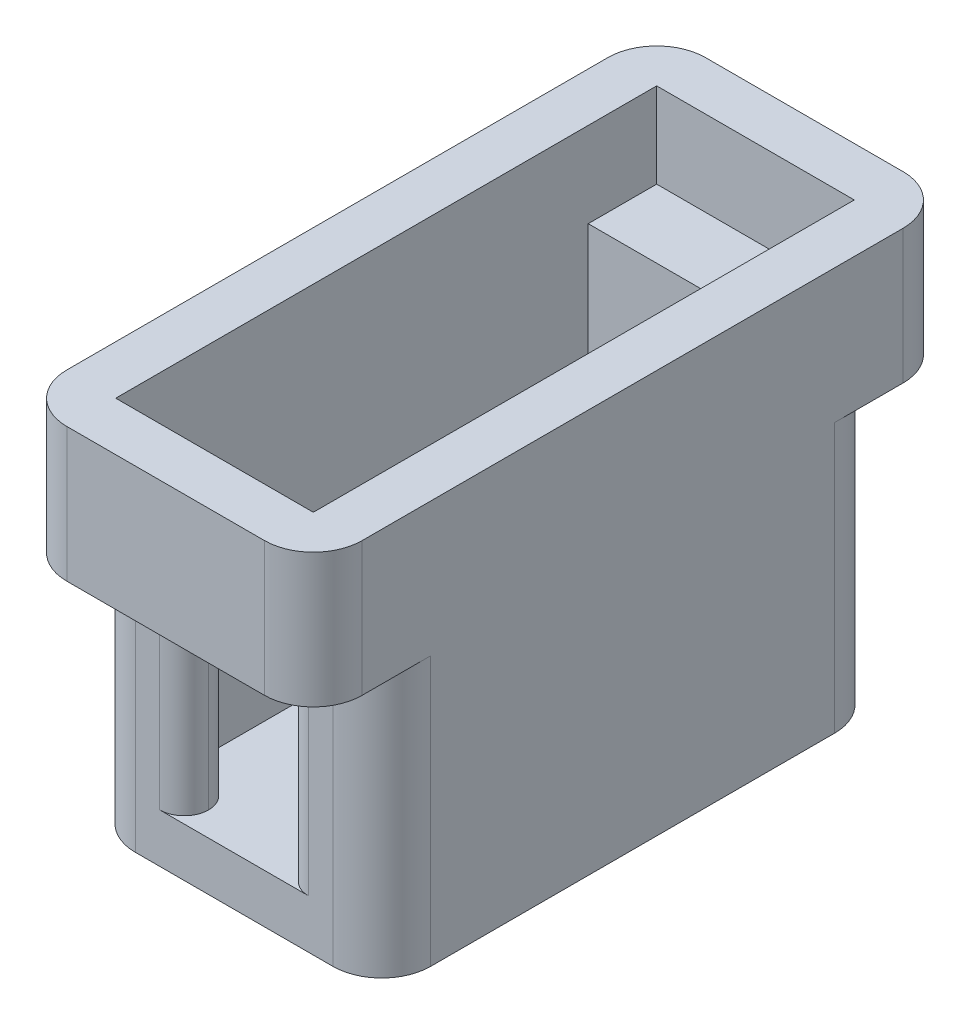
ISO-10303-21;
HEADER;
FILE_DESCRIPTION(('STEP AP214'),'2;1');
FILE_NAME('part.step','',(''),(''),'','','');
FILE_SCHEMA(('AUTOMOTIVE_DESIGN { 1 0 10303 214 1 1 1 1 }'));
ENDSEC;
DATA;
#1=APPLICATION_CONTEXT('core data for automotive mechanical design processes');
#2=APPLICATION_PROTOCOL_DEFINITION('international standard','automotive_design',2000,#1);
#3=PRODUCT_CONTEXT('',#1,'mechanical');
#4=PRODUCT('Part','Part','',(#3));
#5=PRODUCT_RELATED_PRODUCT_CATEGORY('part','',(#4));
#6=PRODUCT_DEFINITION_FORMATION('','',#4);
#7=PRODUCT_DEFINITION_CONTEXT('part definition',#1,'design');
#8=PRODUCT_DEFINITION('design','',#6,#7);
#9=PRODUCT_DEFINITION_SHAPE('','',#8);
#10=(LENGTH_UNIT() NAMED_UNIT(*) SI_UNIT(.MILLI.,.METRE.));
#11=(NAMED_UNIT(*) PLANE_ANGLE_UNIT() SI_UNIT($,.RADIAN.));
#12=(NAMED_UNIT(*) SI_UNIT($,.STERADIAN.) SOLID_ANGLE_UNIT());
#13=UNCERTAINTY_MEASURE_WITH_UNIT(LENGTH_MEASURE(1.E-05),#10,'distance_accuracy_value','');
#14=(GEOMETRIC_REPRESENTATION_CONTEXT(3) GLOBAL_UNCERTAINTY_ASSIGNED_CONTEXT((#13)) GLOBAL_UNIT_ASSIGNED_CONTEXT((#10,
#11,#12)) REPRESENTATION_CONTEXT('',''));
#15=CARTESIAN_POINT('',(0.,0.,0.));
#16=DIRECTION('',(0.,0.,1.));
#17=DIRECTION('',(1.,0.,0.));
#18=AXIS2_PLACEMENT_3D('',#15,#16,#17);
#19=CARTESIAN_POINT('',(0.,32.5,0.));
#20=DIRECTION('',(0.,1.,0.));
#21=DIRECTION('',(0.,0.,1.));
#22=AXIS2_PLACEMENT_3D('',#19,#20,#21);
#23=PLANE('',#22);
#24=DIRECTION('',(-1.,0.,0.));
#25=VECTOR('',#24,1.);
#26=CARTESIAN_POINT('',(-15.1,32.5,25.65));
#27=LINE('',#26,#25);
#28=CARTESIAN_POINT('',(2.59999999999999,32.5,25.65));
#29=VERTEX_POINT('',#28);
#30=CARTESIAN_POINT('',(-2.6,32.5,25.65));
#31=VERTEX_POINT('',#30);
#32=EDGE_CURVE('E351',#29,#31,#27,.T.);
#33=ORIENTED_EDGE('',*,*,#32,.T.);
#34=CARTESIAN_POINT('',(-2.6,32.5,23.15));
#35=DIRECTION('',(0.,1.,0.));
#36=DIRECTION('',(0.,0.,1.));
#37=AXIS2_PLACEMENT_3D('',#34,#35,#36);
#38=CIRCLE('',#37,2.5);
#39=CARTESIAN_POINT('',(-5.1,32.5,23.15));
#40=VERTEX_POINT('',#39);
#41=EDGE_CURVE('E591',#31,#40,#38,.F.);
#42=ORIENTED_EDGE('',*,*,#41,.T.);
#43=CARTESIAN_POINT('',(-7.6,32.5,23.15));
#44=DIRECTION('',(0.,1.,0.));
#45=DIRECTION('',(0.,0.,1.));
#46=AXIS2_PLACEMENT_3D('',#43,#44,#45);
#47=CIRCLE('',#46,2.5);
#48=CARTESIAN_POINT('',(-7.6,32.5,20.65));
#49=VERTEX_POINT('',#48);
#50=EDGE_CURVE('E551',#40,#49,#47,.T.);
#51=ORIENTED_EDGE('',*,*,#50,.T.);
#52=DIRECTION('',(-1.,0.,0.));
#53=VECTOR('',#52,1.);
#54=CARTESIAN_POINT('',(0.,32.5,20.65));
#55=LINE('',#54,#53);
#56=CARTESIAN_POINT('',(-10.1,32.5,20.65));
#57=VERTEX_POINT('',#56);
#58=EDGE_CURVE('E366',#49,#57,#55,.T.);
#59=ORIENTED_EDGE('',*,*,#58,.T.);
#60=DIRECTION('',(0.,0.,1.));
#61=VECTOR('',#60,1.);
#62=CARTESIAN_POINT('',(-10.1,32.5,27.65));
#63=LINE('',#62,#61);
#64=CARTESIAN_POINT('',(-10.1,32.5,27.65));
#65=VERTEX_POINT('',#64);
#66=EDGE_CURVE('E299',#57,#65,#63,.T.);
#67=ORIENTED_EDGE('',*,*,#66,.T.);
#68=DIRECTION('',(1.,0.,0.));
#69=VECTOR('',#68,1.);
#70=CARTESIAN_POINT('',(10.1,32.5,27.65));
#71=LINE('',#70,#69);
#72=CARTESIAN_POINT('',(10.1,32.5,27.65));
#73=VERTEX_POINT('',#72);
#74=EDGE_CURVE('E278',#65,#73,#71,.T.);
#75=ORIENTED_EDGE('',*,*,#74,.T.);
#76=DIRECTION('',(0.,0.,-1.));
#77=VECTOR('',#76,1.);
#78=CARTESIAN_POINT('',(10.1,32.5,27.65));
#79=LINE('',#78,#77);
#80=CARTESIAN_POINT('',(10.1,32.5,20.65));
#81=VERTEX_POINT('',#80);
#82=EDGE_CURVE('E302',#73,#81,#79,.T.);
#83=ORIENTED_EDGE('',*,*,#82,.T.);
#84=CARTESIAN_POINT('',(7.6,32.5,20.65));
#85=VERTEX_POINT('',#84);
#86=EDGE_CURVE('E371',#81,#85,#55,.T.);
#87=ORIENTED_EDGE('',*,*,#86,.T.);
#88=CARTESIAN_POINT('',(7.6,32.5,23.15));
#89=DIRECTION('',(0.,1.,0.));
#90=DIRECTION('',(0.,0.,1.));
#91=AXIS2_PLACEMENT_3D('',#88,#89,#90);
#92=CIRCLE('',#91,2.5);
#93=CARTESIAN_POINT('',(5.1,32.5,23.15));
#94=VERTEX_POINT('',#93);
#95=EDGE_CURVE('E548',#85,#94,#92,.T.);
#96=ORIENTED_EDGE('',*,*,#95,.T.);
#97=CARTESIAN_POINT('',(2.6,32.5,23.15));
#98=DIRECTION('',(0.,1.,0.));
#99=DIRECTION('',(0.,0.,1.));
#100=AXIS2_PLACEMENT_3D('',#97,#98,#99);
#101=CIRCLE('',#100,2.5);
#102=EDGE_CURVE('E11',#94,#29,#101,.F.);
#103=ORIENTED_EDGE('',*,*,#102,.T.);
#104=EDGE_LOOP('',(#33,#42,#51,#59,#67,#75,#83,#87,#96,#103));
#105=FACE_BOUND('',#104,.T.);
#106=ADVANCED_FACE('F41',(#105),#23,.T.);
#107=DIRECTION('',(-1.,0.,0.));
#108=VECTOR('',#107,1.);
#109=CARTESIAN_POINT('',(10.1,32.5,-27.65));
#110=LINE('',#109,#108);
#111=CARTESIAN_POINT('',(10.1,32.5,-27.65));
#112=VERTEX_POINT('',#111);
#113=CARTESIAN_POINT('',(-10.1,32.5,-27.65));
#114=VERTEX_POINT('',#113);
#115=EDGE_CURVE('E272',#112,#114,#110,.T.);
#116=ORIENTED_EDGE('',*,*,#115,.T.);
#117=CARTESIAN_POINT('',(-10.1,32.5,-20.65));
#118=VERTEX_POINT('',#117);
#119=EDGE_CURVE('E295',#114,#118,#63,.T.);
#120=ORIENTED_EDGE('',*,*,#119,.T.);
#121=DIRECTION('',(-1.,0.,0.));
#122=VECTOR('',#121,1.);
#123=CARTESIAN_POINT('',(0.,32.5,-20.65));
#124=LINE('',#123,#122);
#125=CARTESIAN_POINT('',(10.1,32.5,-20.65));
#126=VERTEX_POINT('',#125);
#127=EDGE_CURVE('E369',#126,#118,#124,.T.);
#128=ORIENTED_EDGE('',*,*,#127,.F.);
#129=EDGE_CURVE('E305',#126,#112,#79,.T.);
#130=ORIENTED_EDGE('',*,*,#129,.T.);
#131=EDGE_LOOP('',(#116,#120,#128,#130));
#132=FACE_BOUND('',#131,.T.);
#133=ADVANCED_FACE('F702',(#132),#23,.T.);
#134=CARTESIAN_POINT('',(15.1,5.,-25.65));
#135=DIRECTION('',(0.,0.,1.));
#136=DIRECTION('',(1.,0.,0.));
#137=AXIS2_PLACEMENT_3D('',#134,#135,#136);
#138=PLANE('',#137);
#139=DIRECTION('',(-1.,0.,0.));
#140=VECTOR('',#139,1.);
#141=CARTESIAN_POINT('',(15.1,27.5,-25.65));
#142=LINE('',#141,#140);
#143=CARTESIAN_POINT('',(10.1,27.5,-25.65));
#144=VERTEX_POINT('',#143);
#145=CARTESIAN_POINT('',(-10.1,27.5,-25.65));
#146=VERTEX_POINT('',#145);
#147=EDGE_CURVE('E331',#144,#146,#142,.T.);
#148=ORIENTED_EDGE('',*,*,#147,.F.);
#149=DIRECTION('',(0.,-1.,0.));
#150=VECTOR('',#149,1.);
#151=CARTESIAN_POINT('',(10.1,5.,-25.65));
#152=LINE('',#151,#150);
#153=CARTESIAN_POINT('',(10.1,0.,-25.65));
#154=VERTEX_POINT('',#153);
#155=EDGE_CURVE('E492',#144,#154,#152,.T.);
#156=ORIENTED_EDGE('',*,*,#155,.T.);
#157=DIRECTION('',(-1.,0.,0.));
#158=VECTOR('',#157,1.);
#159=CARTESIAN_POINT('',(15.1,0.,-25.65));
#160=LINE('',#159,#158);
#161=CARTESIAN_POINT('',(-10.1,0.,-25.65));
#162=VERTEX_POINT('',#161);
#163=EDGE_CURVE('E406',#154,#162,#160,.T.);
#164=ORIENTED_EDGE('',*,*,#163,.T.);
#165=DIRECTION('',(0.,-1.,0.));
#166=VECTOR('',#165,1.);
#167=CARTESIAN_POINT('',(-10.1,5.,-25.65));
#168=LINE('',#167,#166);
#169=EDGE_CURVE('E489',#162,#146,#168,.F.);
#170=ORIENTED_EDGE('',*,*,#169,.T.);
#171=EDGE_LOOP('',(#148,#156,#164,#170));
#172=FACE_BOUND('',#171,.T.);
#173=ADVANCED_FACE('F707',(#172),#138,.F.);
#174=CARTESIAN_POINT('',(15.1,5.,25.65));
#175=DIRECTION('',(0.,0.,-1.));
#176=DIRECTION('',(-1.,0.,0.));
#177=AXIS2_PLACEMENT_3D('',#174,#175,#176);
#178=PLANE('',#177);
#179=DIRECTION('',(1.,0.,0.));
#180=VECTOR('',#179,1.);
#181=CARTESIAN_POINT('',(15.1,5.,25.65));
#182=LINE('',#181,#180);
#183=CARTESIAN_POINT('',(-7.6,5.,25.65));
#184=VERTEX_POINT('',#183);
#185=CARTESIAN_POINT('',(7.6,5.,25.65));
#186=VERTEX_POINT('',#185);
#187=EDGE_CURVE('E403',#184,#186,#182,.T.);
#188=ORIENTED_EDGE('',*,*,#187,.F.);
#189=DIRECTION('',(0.,-1.,0.));
#190=VECTOR('',#189,1.);
#191=CARTESIAN_POINT('',(-7.6,27.5,25.65));
#192=LINE('',#191,#190);
#193=CARTESIAN_POINT('',(-7.6,27.5,25.65));
#194=VERTEX_POINT('',#193);
#195=EDGE_CURVE('E534',#184,#194,#192,.F.);
#196=ORIENTED_EDGE('',*,*,#195,.T.);
#197=DIRECTION('',(1.,0.,0.));
#198=VECTOR('',#197,1.);
#199=CARTESIAN_POINT('',(-15.1,27.5,25.65));
#200=LINE('',#199,#198);
#201=CARTESIAN_POINT('',(-10.1,27.5,25.65));
#202=VERTEX_POINT('',#201);
#203=EDGE_CURVE('E352',#202,#194,#200,.T.);
#204=ORIENTED_EDGE('',*,*,#203,.F.);
#205=DIRECTION('',(0.,-1.,0.));
#206=VECTOR('',#205,1.);
#207=CARTESIAN_POINT('',(-10.1,5.,25.65));
#208=LINE('',#207,#206);
#209=CARTESIAN_POINT('',(-10.1,0.,25.65));
#210=VERTEX_POINT('',#209);
#211=EDGE_CURVE('E508',#202,#210,#208,.T.);
#212=ORIENTED_EDGE('',*,*,#211,.T.);
#213=DIRECTION('',(1.,0.,0.));
#214=VECTOR('',#213,1.);
#215=CARTESIAN_POINT('',(15.1,0.,25.65));
#216=LINE('',#215,#214);
#217=CARTESIAN_POINT('',(10.1,0.,25.65));
#218=VERTEX_POINT('',#217);
#219=EDGE_CURVE('E410',#210,#218,#216,.T.);
#220=ORIENTED_EDGE('',*,*,#219,.T.);
#221=DIRECTION('',(0.,-1.,0.));
#222=VECTOR('',#221,1.);
#223=CARTESIAN_POINT('',(10.1,5.,25.65));
#224=LINE('',#223,#222);
#225=CARTESIAN_POINT('',(10.1,27.5,25.65));
#226=VERTEX_POINT('',#225);
#227=EDGE_CURVE('E512',#218,#226,#224,.F.);
#228=ORIENTED_EDGE('',*,*,#227,.T.);
#229=CARTESIAN_POINT('',(7.59999999999999,27.5,25.65));
#230=VERTEX_POINT('',#229);
#231=EDGE_CURVE('E356',#230,#226,#200,.T.);
#232=ORIENTED_EDGE('',*,*,#231,.F.);
#233=DIRECTION('',(0.,-1.,0.));
#234=VECTOR('',#233,1.);
#235=CARTESIAN_POINT('',(7.6,5.,25.65));
#236=LINE('',#235,#234);
#237=EDGE_CURVE('E530',#230,#186,#236,.T.);
#238=ORIENTED_EDGE('',*,*,#237,.T.);
#239=EDGE_LOOP('',(#188,#196,#204,#212,#220,#228,#232,#238));
#240=FACE_BOUND('',#239,.T.);
#241=ADVANCED_FACE('F653',(#240),#178,.F.);
#242=CARTESIAN_POINT('',(0.,5.,0.));
#243=DIRECTION('',(0.,1.,0.));
#244=DIRECTION('',(0.,0.,1.));
#245=AXIS2_PLACEMENT_3D('',#242,#243,#244);
#246=PLANE('',#245);
#247=DIRECTION('',(-1.,0.,0.));
#248=VECTOR('',#247,1.);
#249=CARTESIAN_POINT('',(0.,5.,20.65));
#250=LINE('',#249,#248);
#251=CARTESIAN_POINT('',(-7.6,5.,20.65));
#252=VERTEX_POINT('',#251);
#253=CARTESIAN_POINT('',(-10.1,5.,20.65));
#254=VERTEX_POINT('',#253);
#255=EDGE_CURVE('E365',#252,#254,#250,.T.);
#256=ORIENTED_EDGE('',*,*,#255,.F.);
#257=CARTESIAN_POINT('',(-7.6,5.,23.15));
#258=DIRECTION('',(0.,1.,0.));
#259=DIRECTION('',(0.,0.,1.));
#260=AXIS2_PLACEMENT_3D('',#257,#258,#259);
#261=CIRCLE('',#260,2.5);
#262=CARTESIAN_POINT('',(-5.1,5.,23.15));
#263=VERTEX_POINT('',#262);
#264=EDGE_CURVE('E570',#252,#263,#261,.F.);
#265=ORIENTED_EDGE('',*,*,#264,.T.);
#266=CARTESIAN_POINT('',(-7.6,5.,23.15));
#267=DIRECTION('',(0.,1.,0.));
#268=DIRECTION('',(0.,0.,1.));
#269=AXIS2_PLACEMENT_3D('',#266,#267,#268);
#270=CIRCLE('',#269,2.5);
#271=EDGE_CURVE('E557',#263,#184,#270,.F.);
#272=ORIENTED_EDGE('',*,*,#271,.T.);
#273=ORIENTED_EDGE('',*,*,#187,.T.);
#274=CARTESIAN_POINT('',(7.6,5.,23.15));
#275=DIRECTION('',(0.,1.,0.));
#276=DIRECTION('',(0.,0.,1.));
#277=AXIS2_PLACEMENT_3D('',#274,#275,#276);
#278=CIRCLE('',#277,2.5);
#279=CARTESIAN_POINT('',(5.1,5.,23.15));
#280=VERTEX_POINT('',#279);
#281=EDGE_CURVE('E564',#186,#280,#278,.F.);
#282=ORIENTED_EDGE('',*,*,#281,.T.);
#283=CARTESIAN_POINT('',(7.6,5.,23.15));
#284=DIRECTION('',(0.,1.,0.));
#285=DIRECTION('',(0.,0.,1.));
#286=AXIS2_PLACEMENT_3D('',#283,#284,#285);
#287=CIRCLE('',#286,2.5);
#288=CARTESIAN_POINT('',(7.6,5.,20.65));
#289=VERTEX_POINT('',#288);
#290=EDGE_CURVE('E573',#280,#289,#287,.F.);
#291=ORIENTED_EDGE('',*,*,#290,.T.);
#292=CARTESIAN_POINT('',(10.1,5.,20.65));
#293=VERTEX_POINT('',#292);
#294=EDGE_CURVE('E370',#293,#289,#250,.T.);
#295=ORIENTED_EDGE('',*,*,#294,.F.);
#296=DIRECTION('',(0.,0.,-1.));
#297=VECTOR('',#296,1.);
#298=CARTESIAN_POINT('',(10.1,5.,0.));
#299=LINE('',#298,#297);
#300=CARTESIAN_POINT('',(10.1,5.,-20.65));
#301=VERTEX_POINT('',#300);
#302=EDGE_CURVE('E383',#293,#301,#299,.T.);
#303=ORIENTED_EDGE('',*,*,#302,.T.);
#304=DIRECTION('',(-1.,0.,0.));
#305=VECTOR('',#304,1.);
#306=CARTESIAN_POINT('',(0.,5.,-20.65));
#307=LINE('',#306,#305);
#308=CARTESIAN_POINT('',(-10.1,5.,-20.65));
#309=VERTEX_POINT('',#308);
#310=EDGE_CURVE('E380',#301,#309,#307,.T.);
#311=ORIENTED_EDGE('',*,*,#310,.T.);
#312=DIRECTION('',(0.,0.,-1.));
#313=VECTOR('',#312,1.);
#314=CARTESIAN_POINT('',(-10.1,5.,0.));
#315=LINE('',#314,#313);
#316=EDGE_CURVE('E377',#254,#309,#315,.T.);
#317=ORIENTED_EDGE('',*,*,#316,.F.);
#318=EDGE_LOOP('',(#256,#265,#272,#273,#282,#291,#295,#303,#311,#317));
#319=FACE_BOUND('',#318,.T.);
#320=ADVANCED_FACE('F633',(#319),#246,.T.);
#321=CARTESIAN_POINT('',(-15.1,5.,25.65));
#322=DIRECTION('',(1.,0.,0.));
#323=DIRECTION('',(0.,0.,-1.));
#324=AXIS2_PLACEMENT_3D('',#321,#322,#323);
#325=PLANE('',#324);
#326=DIRECTION('',(0.,0.,-1.));
#327=VECTOR('',#326,1.);
#328=CARTESIAN_POINT('',(-15.1,27.5,32.65));
#329=LINE('',#328,#327);
#330=CARTESIAN_POINT('',(-15.1,27.5,27.65));
#331=VERTEX_POINT('',#330);
#332=CARTESIAN_POINT('',(-15.1,27.5,20.65));
#333=VERTEX_POINT('',#332);
#334=EDGE_CURVE('E362',#331,#333,#329,.T.);
#335=ORIENTED_EDGE('',*,*,#334,.F.);
#336=DIRECTION('',(0.,-1.,0.));
#337=VECTOR('',#336,1.);
#338=CARTESIAN_POINT('',(-15.1,41.2,27.65));
#339=LINE('',#338,#337);
#340=CARTESIAN_POINT('',(-15.1,41.2,27.65));
#341=VERTEX_POINT('',#340);
#342=EDGE_CURVE('E446',#331,#341,#339,.F.);
#343=ORIENTED_EDGE('',*,*,#342,.T.);
#344=DIRECTION('',(0.,0.,1.));
#345=VECTOR('',#344,1.);
#346=CARTESIAN_POINT('',(-15.1,41.2,-32.65));
#347=LINE('',#346,#345);
#348=CARTESIAN_POINT('',(-15.1,41.2,-27.65));
#349=VERTEX_POINT('',#348);
#350=EDGE_CURVE('E280',#349,#341,#347,.T.);
#351=ORIENTED_EDGE('',*,*,#350,.F.);
#352=DIRECTION('',(0.,1.,0.));
#353=VECTOR('',#352,1.);
#354=CARTESIAN_POINT('',(-15.1,27.5,-27.65));
#355=LINE('',#354,#353);
#356=CARTESIAN_POINT('',(-15.1,27.5,-27.65));
#357=VERTEX_POINT('',#356);
#358=EDGE_CURVE('E443',#349,#357,#355,.F.);
#359=ORIENTED_EDGE('',*,*,#358,.T.);
#360=DIRECTION('',(0.,0.,1.));
#361=VECTOR('',#360,1.);
#362=CARTESIAN_POINT('',(-15.1,27.5,-32.65));
#363=LINE('',#362,#361);
#364=CARTESIAN_POINT('',(-15.1,27.5,-20.65));
#365=VERTEX_POINT('',#364);
#366=EDGE_CURVE('E336',#357,#365,#363,.T.);
#367=ORIENTED_EDGE('',*,*,#366,.T.);
#368=DIRECTION('',(0.,-1.,0.));
#369=VECTOR('',#368,1.);
#370=CARTESIAN_POINT('',(-15.1,5.,-20.65));
#371=LINE('',#370,#369);
#372=CARTESIAN_POINT('',(-15.1,0.,-20.65));
#373=VERTEX_POINT('',#372);
#374=EDGE_CURVE('E439',#365,#373,#371,.T.);
#375=ORIENTED_EDGE('',*,*,#374,.T.);
#376=DIRECTION('',(0.,0.,1.));
#377=VECTOR('',#376,1.);
#378=CARTESIAN_POINT('',(-15.1,0.,25.65));
#379=LINE('',#378,#377);
#380=CARTESIAN_POINT('',(-15.1,0.,20.65));
#381=VERTEX_POINT('',#380);
#382=EDGE_CURVE('E402',#373,#381,#379,.T.);
#383=ORIENTED_EDGE('',*,*,#382,.T.);
#384=DIRECTION('',(0.,-1.,0.));
#385=VECTOR('',#384,1.);
#386=CARTESIAN_POINT('',(-15.1,5.,20.65));
#387=LINE('',#386,#385);
#388=EDGE_CURVE('E435',#381,#333,#387,.F.);
#389=ORIENTED_EDGE('',*,*,#388,.T.);
#390=EDGE_LOOP('',(#335,#343,#351,#359,#367,#375,#383,#389));
#391=FACE_BOUND('',#390,.T.);
#392=ADVANCED_FACE('F680',(#391),#325,.F.);
#393=CARTESIAN_POINT('',(15.1,5.,25.65));
#394=DIRECTION('',(-1.,0.,0.));
#395=DIRECTION('',(0.,0.,1.));
#396=AXIS2_PLACEMENT_3D('',#393,#394,#395);
#397=PLANE('',#396);
#398=DIRECTION('',(0.,0.,-1.));
#399=VECTOR('',#398,1.);
#400=CARTESIAN_POINT('',(15.1,41.2,-32.65));
#401=LINE('',#400,#399);
#402=CARTESIAN_POINT('',(15.1,41.2,27.65));
#403=VERTEX_POINT('',#402);
#404=CARTESIAN_POINT('',(15.1,41.2,-27.65));
#405=VERTEX_POINT('',#404);
#406=EDGE_CURVE('E323',#403,#405,#401,.T.);
#407=ORIENTED_EDGE('',*,*,#406,.F.);
#408=DIRECTION('',(0.,1.,0.));
#409=VECTOR('',#408,1.);
#410=CARTESIAN_POINT('',(15.1,27.5,27.65));
#411=LINE('',#410,#409);
#412=CARTESIAN_POINT('',(15.1,27.5,27.65));
#413=VERTEX_POINT('',#412);
#414=EDGE_CURVE('E472',#403,#413,#411,.F.);
#415=ORIENTED_EDGE('',*,*,#414,.T.);
#416=DIRECTION('',(0.,0.,-1.));
#417=VECTOR('',#416,1.);
#418=CARTESIAN_POINT('',(15.1,27.5,32.65));
#419=LINE('',#418,#417);
#420=CARTESIAN_POINT('',(15.1,27.5,20.65));
#421=VERTEX_POINT('',#420);
#422=EDGE_CURVE('E350',#413,#421,#419,.T.);
#423=ORIENTED_EDGE('',*,*,#422,.T.);
#424=DIRECTION('',(0.,-1.,0.));
#425=VECTOR('',#424,1.);
#426=CARTESIAN_POINT('',(15.1,5.,20.65));
#427=LINE('',#426,#425);
#428=CARTESIAN_POINT('',(15.1,0.,20.65));
#429=VERTEX_POINT('',#428);
#430=EDGE_CURVE('E461',#421,#429,#427,.T.);
#431=ORIENTED_EDGE('',*,*,#430,.T.);
#432=DIRECTION('',(0.,0.,-1.));
#433=VECTOR('',#432,1.);
#434=CARTESIAN_POINT('',(15.1,0.,25.65));
#435=LINE('',#434,#433);
#436=CARTESIAN_POINT('',(15.1,0.,-20.65));
#437=VERTEX_POINT('',#436);
#438=EDGE_CURVE('E414',#429,#437,#435,.T.);
#439=ORIENTED_EDGE('',*,*,#438,.T.);
#440=DIRECTION('',(0.,-1.,0.));
#441=VECTOR('',#440,1.);
#442=CARTESIAN_POINT('',(15.1,5.,-20.65));
#443=LINE('',#442,#441);
#444=CARTESIAN_POINT('',(15.1,27.5,-20.65));
#445=VERTEX_POINT('',#444);
#446=EDGE_CURVE('E465',#437,#445,#443,.F.);
#447=ORIENTED_EDGE('',*,*,#446,.T.);
#448=DIRECTION('',(0.,0.,1.));
#449=VECTOR('',#448,1.);
#450=CARTESIAN_POINT('',(15.1,27.5,-32.65));
#451=LINE('',#450,#449);
#452=CARTESIAN_POINT('',(15.1,27.5,-27.65));
#453=VERTEX_POINT('',#452);
#454=EDGE_CURVE('E342',#453,#445,#451,.T.);
#455=ORIENTED_EDGE('',*,*,#454,.F.);
#456=DIRECTION('',(0.,-1.,0.));
#457=VECTOR('',#456,1.);
#458=CARTESIAN_POINT('',(15.1,41.2,-27.65));
#459=LINE('',#458,#457);
#460=EDGE_CURVE('E469',#453,#405,#459,.F.);
#461=ORIENTED_EDGE('',*,*,#460,.T.);
#462=EDGE_LOOP('',(#407,#415,#423,#431,#439,#447,#455,#461));
#463=FACE_BOUND('',#462,.T.);
#464=ADVANCED_FACE('F728',(#463),#397,.F.);
#465=CARTESIAN_POINT('',(0.,0.,0.));
#466=DIRECTION('',(0.,1.,0.));
#467=DIRECTION('',(0.,0.,1.));
#468=AXIS2_PLACEMENT_3D('',#465,#466,#467);
#469=PLANE('',#468);
#470=ORIENTED_EDGE('',*,*,#163,.F.);
#471=CARTESIAN_POINT('',(10.1,0.,-20.65));
#472=DIRECTION('',(0.,1.,0.));
#473=DIRECTION('',(0.,0.,1.));
#474=AXIS2_PLACEMENT_3D('',#471,#472,#473);
#475=CIRCLE('',#474,5.);
#476=EDGE_CURVE('E505',#154,#437,#475,.F.);
#477=ORIENTED_EDGE('',*,*,#476,.T.);
#478=ORIENTED_EDGE('',*,*,#438,.F.);
#479=CARTESIAN_POINT('',(10.1,0.,20.65));
#480=DIRECTION('',(0.,1.,0.));
#481=DIRECTION('',(0.,0.,1.));
#482=AXIS2_PLACEMENT_3D('',#479,#480,#481);
#483=CIRCLE('',#482,5.);
#484=EDGE_CURVE('E499',#429,#218,#483,.F.);
#485=ORIENTED_EDGE('',*,*,#484,.T.);
#486=ORIENTED_EDGE('',*,*,#219,.F.);
#487=CARTESIAN_POINT('',(-10.1,0.,20.65));
#488=DIRECTION('',(0.,1.,0.));
#489=DIRECTION('',(0.,0.,1.));
#490=AXIS2_PLACEMENT_3D('',#487,#488,#489);
#491=CIRCLE('',#490,5.);
#492=EDGE_CURVE('E496',#210,#381,#491,.F.);
#493=ORIENTED_EDGE('',*,*,#492,.T.);
#494=ORIENTED_EDGE('',*,*,#382,.F.);
#495=CARTESIAN_POINT('',(-10.1,0.,-20.65));
#496=DIRECTION('',(0.,1.,0.));
#497=DIRECTION('',(0.,0.,1.));
#498=AXIS2_PLACEMENT_3D('',#495,#496,#497);
#499=CIRCLE('',#498,5.);
#500=EDGE_CURVE('E502',#373,#162,#499,.F.);
#501=ORIENTED_EDGE('',*,*,#500,.T.);
#502=EDGE_LOOP('',(#470,#477,#478,#485,#486,#493,#494,#501));
#503=FACE_BOUND('',#502,.T.);
#504=ADVANCED_FACE('F725',(#503),#469,.F.);
#505=CARTESIAN_POINT('',(0.,32.5,20.65));
#506=DIRECTION('',(0.,0.,1.));
#507=DIRECTION('',(1.,0.,0.));
#508=AXIS2_PLACEMENT_3D('',#505,#506,#507);
#509=PLANE('',#508);
#510=ORIENTED_EDGE('',*,*,#58,.F.);
#511=DIRECTION('',(0.,-1.,0.));
#512=VECTOR('',#511,1.);
#513=CARTESIAN_POINT('',(-7.6,5.,20.65));
#514=LINE('',#513,#512);
#515=EDGE_CURVE('E545',#49,#252,#514,.T.);
#516=ORIENTED_EDGE('',*,*,#515,.T.);
#517=ORIENTED_EDGE('',*,*,#255,.T.);
#518=DIRECTION('',(0.,-1.,0.));
#519=VECTOR('',#518,1.);
#520=CARTESIAN_POINT('',(-10.1,32.5,20.65));
#521=LINE('',#520,#519);
#522=EDGE_CURVE('E398',#57,#254,#521,.T.);
#523=ORIENTED_EDGE('',*,*,#522,.F.);
#524=EDGE_LOOP('',(#510,#516,#517,#523));
#525=FACE_BOUND('',#524,.T.);
#526=ADVANCED_FACE('F629',(#525),#509,.F.);
#527=CARTESIAN_POINT('',(-10.1,32.5,0.));
#528=DIRECTION('',(-1.,0.,0.));
#529=DIRECTION('',(0.,0.,1.));
#530=AXIS2_PLACEMENT_3D('',#527,#528,#529);
#531=PLANE('',#530);
#532=ORIENTED_EDGE('',*,*,#316,.T.);
#533=DIRECTION('',(0.,-1.,0.));
#534=VECTOR('',#533,1.);
#535=CARTESIAN_POINT('',(-10.1,32.5,-20.65));
#536=LINE('',#535,#534);
#537=EDGE_CURVE('E394',#118,#309,#536,.T.);
#538=ORIENTED_EDGE('',*,*,#537,.F.);
#539=ORIENTED_EDGE('',*,*,#119,.F.);
#540=DIRECTION('',(0.,-1.,0.));
#541=VECTOR('',#540,1.);
#542=CARTESIAN_POINT('',(-10.1,41.2,-27.65));
#543=LINE('',#542,#541);
#544=CARTESIAN_POINT('',(-10.1,41.2,-27.65));
#545=VERTEX_POINT('',#544);
#546=EDGE_CURVE('E266',#545,#114,#543,.T.);
#547=ORIENTED_EDGE('',*,*,#546,.F.);
#548=DIRECTION('',(0.,0.,1.));
#549=VECTOR('',#548,1.);
#550=CARTESIAN_POINT('',(-10.1,41.2,27.65));
#551=LINE('',#550,#549);
#552=CARTESIAN_POINT('',(-10.1,41.2,27.65));
#553=VERTEX_POINT('',#552);
#554=EDGE_CURVE('E258',#545,#553,#551,.T.);
#555=ORIENTED_EDGE('',*,*,#554,.T.);
#556=DIRECTION('',(0.,-1.,0.));
#557=VECTOR('',#556,1.);
#558=CARTESIAN_POINT('',(-10.1,41.2,27.65));
#559=LINE('',#558,#557);
#560=EDGE_CURVE('E263',#553,#65,#559,.T.);
#561=ORIENTED_EDGE('',*,*,#560,.T.);
#562=ORIENTED_EDGE('',*,*,#66,.F.);
#563=ORIENTED_EDGE('',*,*,#522,.T.);
#564=EDGE_LOOP('',(#532,#538,#539,#547,#555,#561,#562,#563));
#565=FACE_BOUND('',#564,.T.);
#566=ADVANCED_FACE('F261',(#565),#531,.F.);
#567=CARTESIAN_POINT('',(0.,32.5,-20.65));
#568=DIRECTION('',(0.,0.,1.));
#569=DIRECTION('',(1.,0.,0.));
#570=AXIS2_PLACEMENT_3D('',#567,#568,#569);
#571=PLANE('',#570);
#572=ORIENTED_EDGE('',*,*,#310,.F.);
#573=DIRECTION('',(0.,-1.,0.));
#574=VECTOR('',#573,1.);
#575=CARTESIAN_POINT('',(10.1,32.5,-20.65));
#576=LINE('',#575,#574);
#577=EDGE_CURVE('E390',#126,#301,#576,.T.);
#578=ORIENTED_EDGE('',*,*,#577,.F.);
#579=ORIENTED_EDGE('',*,*,#127,.T.);
#580=ORIENTED_EDGE('',*,*,#537,.T.);
#581=EDGE_LOOP('',(#572,#578,#579,#580));
#582=FACE_BOUND('',#581,.T.);
#583=ADVANCED_FACE('F716',(#582),#571,.T.);
#584=CARTESIAN_POINT('',(10.1,32.5,0.));
#585=DIRECTION('',(-1.,0.,0.));
#586=DIRECTION('',(0.,0.,1.));
#587=AXIS2_PLACEMENT_3D('',#584,#585,#586);
#588=PLANE('',#587);
#589=ORIENTED_EDGE('',*,*,#302,.F.);
#590=DIRECTION('',(0.,-1.,0.));
#591=VECTOR('',#590,1.);
#592=CARTESIAN_POINT('',(10.1,32.5,20.65));
#593=LINE('',#592,#591);
#594=EDGE_CURVE('E386',#81,#293,#593,.T.);
#595=ORIENTED_EDGE('',*,*,#594,.F.);
#596=ORIENTED_EDGE('',*,*,#82,.F.);
#597=DIRECTION('',(0.,-1.,0.));
#598=VECTOR('',#597,1.);
#599=CARTESIAN_POINT('',(10.1,41.2,27.65));
#600=LINE('',#599,#598);
#601=CARTESIAN_POINT('',(10.1,41.2,27.65));
#602=VERTEX_POINT('',#601);
#603=EDGE_CURVE('E281',#602,#73,#600,.T.);
#604=ORIENTED_EDGE('',*,*,#603,.F.);
#605=DIRECTION('',(0.,0.,-1.));
#606=VECTOR('',#605,1.);
#607=CARTESIAN_POINT('',(10.1,41.2,27.65));
#608=LINE('',#607,#606);
#609=CARTESIAN_POINT('',(10.1,41.2,-27.65));
#610=VERTEX_POINT('',#609);
#611=EDGE_CURVE('E286',#602,#610,#608,.T.);
#612=ORIENTED_EDGE('',*,*,#611,.T.);
#613=DIRECTION('',(0.,-1.,0.));
#614=VECTOR('',#613,1.);
#615=CARTESIAN_POINT('',(10.1,41.2,-27.65));
#616=LINE('',#615,#614);
#617=EDGE_CURVE('E311',#610,#112,#616,.T.);
#618=ORIENTED_EDGE('',*,*,#617,.T.);
#619=ORIENTED_EDGE('',*,*,#129,.F.);
#620=ORIENTED_EDGE('',*,*,#577,.T.);
#621=EDGE_LOOP('',(#589,#595,#596,#604,#612,#618,#619,#620));
#622=FACE_BOUND('',#621,.T.);
#623=ADVANCED_FACE('F713',(#622),#588,.T.);
#624=ORIENTED_EDGE('',*,*,#294,.T.);
#625=DIRECTION('',(0.,-1.,0.));
#626=VECTOR('',#625,1.);
#627=CARTESIAN_POINT('',(7.6,32.5,20.65));
#628=LINE('',#627,#626);
#629=EDGE_CURVE('E554',#289,#85,#628,.F.);
#630=ORIENTED_EDGE('',*,*,#629,.T.);
#631=ORIENTED_EDGE('',*,*,#86,.F.);
#632=ORIENTED_EDGE('',*,*,#594,.T.);
#633=EDGE_LOOP('',(#624,#630,#631,#632));
#634=FACE_BOUND('',#633,.T.);
#635=ADVANCED_FACE('F650',(#634),#509,.F.);
#636=CARTESIAN_POINT('',(0.,0.,25.65));
#637=DIRECTION('',(0.,0.,1.));
#638=DIRECTION('',(1.,0.,0.));
#639=AXIS2_PLACEMENT_3D('',#636,#637,#638);
#640=PLANE('',#639);
#641=CARTESIAN_POINT('',(-2.6,27.5,25.65));
#642=VERTEX_POINT('',#641);
#643=CARTESIAN_POINT('',(2.59999999999999,27.5,25.65));
#644=VERTEX_POINT('',#643);
#645=EDGE_CURVE('E345',#642,#644,#200,.T.);
#646=ORIENTED_EDGE('',*,*,#645,.F.);
#647=DIRECTION('',(0.,-1.,0.));
#648=VECTOR('',#647,1.);
#649=CARTESIAN_POINT('',(-2.6,0.,25.65));
#650=LINE('',#649,#648);
#651=EDGE_CURVE('E586',#642,#31,#650,.F.);
#652=ORIENTED_EDGE('',*,*,#651,.T.);
#653=ORIENTED_EDGE('',*,*,#32,.F.);
#654=DIRECTION('',(0.,-1.,0.));
#655=VECTOR('',#654,1.);
#656=CARTESIAN_POINT('',(2.6,27.5,25.65));
#657=LINE('',#656,#655);
#658=EDGE_CURVE('E576',#29,#644,#657,.T.);
#659=ORIENTED_EDGE('',*,*,#658,.T.);
#660=EDGE_LOOP('',(#646,#652,#653,#659));
#661=FACE_BOUND('',#660,.T.);
#662=ADVANCED_FACE('F615',(#661),#640,.F.);
#663=CARTESIAN_POINT('',(-15.1,27.5,32.65));
#664=DIRECTION('',(0.,1.,0.));
#665=DIRECTION('',(0.,0.,1.));
#666=AXIS2_PLACEMENT_3D('',#663,#664,#665);
#667=PLANE('',#666);
#668=DIRECTION('',(1.,0.,0.));
#669=VECTOR('',#668,1.);
#670=CARTESIAN_POINT('',(-15.1,27.5,32.65));
#671=LINE('',#670,#669);
#672=CARTESIAN_POINT('',(-10.1,27.5,32.65));
#673=VERTEX_POINT('',#672);
#674=CARTESIAN_POINT('',(10.1,27.5,32.65));
#675=VERTEX_POINT('',#674);
#676=EDGE_CURVE('E346',#673,#675,#671,.T.);
#677=ORIENTED_EDGE('',*,*,#676,.F.);
#678=CARTESIAN_POINT('',(-10.1,27.5,27.65));
#679=DIRECTION('',(0.,1.,0.));
#680=DIRECTION('',(0.,0.,1.));
#681=AXIS2_PLACEMENT_3D('',#678,#679,#680);
#682=CIRCLE('',#681,5.);
#683=EDGE_CURVE('E432',#673,#331,#682,.F.);
#684=ORIENTED_EDGE('',*,*,#683,.T.);
#685=ORIENTED_EDGE('',*,*,#334,.T.);
#686=CARTESIAN_POINT('',(-10.1,27.5,20.65));
#687=DIRECTION('',(0.,1.,0.));
#688=DIRECTION('',(0.,0.,1.));
#689=AXIS2_PLACEMENT_3D('',#686,#687,#688);
#690=CIRCLE('',#689,5.);
#691=EDGE_CURVE('E527',#333,#202,#690,.T.);
#692=ORIENTED_EDGE('',*,*,#691,.T.);
#693=ORIENTED_EDGE('',*,*,#203,.T.);
#694=CARTESIAN_POINT('',(-7.6,27.5,23.15));
#695=DIRECTION('',(0.,1.,0.));
#696=DIRECTION('',(0.,0.,1.));
#697=AXIS2_PLACEMENT_3D('',#694,#695,#696);
#698=CIRCLE('',#697,2.5);
#699=CARTESIAN_POINT('',(-5.1,27.5,23.15));
#700=VERTEX_POINT('',#699);
#701=EDGE_CURVE('E561',#194,#700,#698,.T.);
#702=ORIENTED_EDGE('',*,*,#701,.T.);
#703=CARTESIAN_POINT('',(-2.6,27.5,23.15));
#704=DIRECTION('',(0.,1.,0.));
#705=DIRECTION('',(0.,0.,1.));
#706=AXIS2_PLACEMENT_3D('',#703,#704,#705);
#707=CIRCLE('',#706,2.5);
#708=EDGE_CURVE('E64',#700,#642,#707,.T.);
#709=ORIENTED_EDGE('',*,*,#708,.T.);
#710=ORIENTED_EDGE('',*,*,#645,.T.);
#711=CARTESIAN_POINT('',(2.6,27.5,23.15));
#712=DIRECTION('',(0.,1.,0.));
#713=DIRECTION('',(0.,0.,1.));
#714=AXIS2_PLACEMENT_3D('',#711,#712,#713);
#715=CIRCLE('',#714,2.5);
#716=CARTESIAN_POINT('',(5.1,27.5,23.15));
#717=VERTEX_POINT('',#716);
#718=EDGE_CURVE('E50',#644,#717,#715,.T.);
#719=ORIENTED_EDGE('',*,*,#718,.T.);
#720=CARTESIAN_POINT('',(7.6,27.5,23.15));
#721=DIRECTION('',(0.,1.,0.));
#722=DIRECTION('',(0.,0.,1.));
#723=AXIS2_PLACEMENT_3D('',#720,#721,#722);
#724=CIRCLE('',#723,2.5);
#725=EDGE_CURVE('E567',#717,#230,#724,.T.);
#726=ORIENTED_EDGE('',*,*,#725,.T.);
#727=ORIENTED_EDGE('',*,*,#231,.T.);
#728=CARTESIAN_POINT('',(10.1,27.5,20.65));
#729=DIRECTION('',(0.,1.,0.));
#730=DIRECTION('',(0.,0.,1.));
#731=AXIS2_PLACEMENT_3D('',#728,#729,#730);
#732=CIRCLE('',#731,5.);
#733=EDGE_CURVE('E523',#226,#421,#732,.T.);
#734=ORIENTED_EDGE('',*,*,#733,.T.);
#735=ORIENTED_EDGE('',*,*,#422,.F.);
#736=CARTESIAN_POINT('',(10.1,27.5,27.65));
#737=DIRECTION('',(0.,1.,0.));
#738=DIRECTION('',(0.,0.,1.));
#739=AXIS2_PLACEMENT_3D('',#736,#737,#738);
#740=CIRCLE('',#739,5.);
#741=EDGE_CURVE('E429',#413,#675,#740,.F.);
#742=ORIENTED_EDGE('',*,*,#741,.T.);
#743=EDGE_LOOP('',(#677,#684,#685,#692,#693,#702,#709,#710,#719,#726,#727,#734,#735,#742));
#744=FACE_BOUND('',#743,.T.);
#745=ADVANCED_FACE('F596',(#744),#667,.F.);
#746=CARTESIAN_POINT('',(0.,0.,32.65));
#747=DIRECTION('',(0.,0.,1.));
#748=DIRECTION('',(1.,0.,0.));
#749=AXIS2_PLACEMENT_3D('',#746,#747,#748);
#750=PLANE('',#749);
#751=DIRECTION('',(1.,0.,0.));
#752=VECTOR('',#751,1.);
#753=CARTESIAN_POINT('',(-15.1,41.2,32.65));
#754=LINE('',#753,#752);
#755=CARTESIAN_POINT('',(-10.1,41.2,32.65));
#756=VERTEX_POINT('',#755);
#757=CARTESIAN_POINT('',(10.1,41.2,32.65));
#758=VERTEX_POINT('',#757);
#759=EDGE_CURVE('E319',#756,#758,#754,.T.);
#760=ORIENTED_EDGE('',*,*,#759,.F.);
#761=DIRECTION('',(0.,-1.,0.));
#762=VECTOR('',#761,1.);
#763=CARTESIAN_POINT('',(-10.1,27.5,32.65));
#764=LINE('',#763,#762);
#765=EDGE_CURVE('E425',#756,#673,#764,.T.);
#766=ORIENTED_EDGE('',*,*,#765,.T.);
#767=ORIENTED_EDGE('',*,*,#676,.T.);
#768=DIRECTION('',(0.,1.,0.));
#769=VECTOR('',#768,1.);
#770=CARTESIAN_POINT('',(10.1,41.2,32.65));
#771=LINE('',#770,#769);
#772=EDGE_CURVE('E421',#675,#758,#771,.T.);
#773=ORIENTED_EDGE('',*,*,#772,.T.);
#774=EDGE_LOOP('',(#760,#766,#767,#773));
#775=FACE_BOUND('',#774,.T.);
#776=ADVANCED_FACE('F669',(#775),#750,.T.);
#777=CARTESIAN_POINT('',(15.1,27.5,-32.65));
#778=DIRECTION('',(0.,1.,0.));
#779=DIRECTION('',(0.,0.,1.));
#780=AXIS2_PLACEMENT_3D('',#777,#778,#779);
#781=PLANE('',#780);
#782=DIRECTION('',(-1.,0.,0.));
#783=VECTOR('',#782,1.);
#784=CARTESIAN_POINT('',(15.1,27.5,-32.65));
#785=LINE('',#784,#783);
#786=CARTESIAN_POINT('',(10.1,27.5,-32.65));
#787=VERTEX_POINT('',#786);
#788=CARTESIAN_POINT('',(-10.1,27.5,-32.65));
#789=VERTEX_POINT('',#788);
#790=EDGE_CURVE('E332',#787,#789,#785,.T.);
#791=ORIENTED_EDGE('',*,*,#790,.F.);
#792=CARTESIAN_POINT('',(10.1,27.5,-27.65));
#793=DIRECTION('',(0.,1.,0.));
#794=DIRECTION('',(0.,0.,1.));
#795=AXIS2_PLACEMENT_3D('',#792,#793,#794);
#796=CIRCLE('',#795,5.);
#797=EDGE_CURVE('E486',#787,#453,#796,.F.);
#798=ORIENTED_EDGE('',*,*,#797,.T.);
#799=ORIENTED_EDGE('',*,*,#454,.T.);
#800=CARTESIAN_POINT('',(10.1,27.5,-20.65));
#801=DIRECTION('',(0.,1.,0.));
#802=DIRECTION('',(0.,0.,1.));
#803=AXIS2_PLACEMENT_3D('',#800,#801,#802);
#804=CIRCLE('',#803,5.);
#805=EDGE_CURVE('E516',#445,#144,#804,.T.);
#806=ORIENTED_EDGE('',*,*,#805,.T.);
#807=ORIENTED_EDGE('',*,*,#147,.T.);
#808=CARTESIAN_POINT('',(-10.1,27.5,-20.65));
#809=DIRECTION('',(0.,1.,0.));
#810=DIRECTION('',(0.,0.,1.));
#811=AXIS2_PLACEMENT_3D('',#808,#809,#810);
#812=CIRCLE('',#811,5.);
#813=EDGE_CURVE('E519',#146,#365,#812,.T.);
#814=ORIENTED_EDGE('',*,*,#813,.T.);
#815=ORIENTED_EDGE('',*,*,#366,.F.);
#816=CARTESIAN_POINT('',(-10.1,27.5,-27.65));
#817=DIRECTION('',(0.,1.,0.));
#818=DIRECTION('',(0.,0.,1.));
#819=AXIS2_PLACEMENT_3D('',#816,#817,#818);
#820=CIRCLE('',#819,5.);
#821=EDGE_CURVE('E483',#357,#789,#820,.F.);
#822=ORIENTED_EDGE('',*,*,#821,.T.);
#823=EDGE_LOOP('',(#791,#798,#799,#806,#807,#814,#815,#822));
#824=FACE_BOUND('',#823,.T.);
#825=ADVANCED_FACE('F968',(#824),#781,.F.);
#826=CARTESIAN_POINT('',(0.,0.,-32.65));
#827=DIRECTION('',(0.,0.,-1.));
#828=DIRECTION('',(-1.,0.,0.));
#829=AXIS2_PLACEMENT_3D('',#826,#827,#828);
#830=PLANE('',#829);
#831=DIRECTION('',(-1.,0.,0.));
#832=VECTOR('',#831,1.);
#833=CARTESIAN_POINT('',(-15.1,41.2,-32.65));
#834=LINE('',#833,#832);
#835=CARTESIAN_POINT('',(10.1,41.2,-32.65));
#836=VERTEX_POINT('',#835);
#837=CARTESIAN_POINT('',(-10.1,41.2,-32.65));
#838=VERTEX_POINT('',#837);
#839=EDGE_CURVE('E327',#836,#838,#834,.T.);
#840=ORIENTED_EDGE('',*,*,#839,.F.);
#841=DIRECTION('',(0.,-1.,0.));
#842=VECTOR('',#841,1.);
#843=CARTESIAN_POINT('',(10.1,27.5,-32.65));
#844=LINE('',#843,#842);
#845=EDGE_CURVE('E479',#836,#787,#844,.T.);
#846=ORIENTED_EDGE('',*,*,#845,.T.);
#847=ORIENTED_EDGE('',*,*,#790,.T.);
#848=DIRECTION('',(0.,1.,0.));
#849=VECTOR('',#848,1.);
#850=CARTESIAN_POINT('',(-10.1,41.2,-32.65));
#851=LINE('',#850,#849);
#852=EDGE_CURVE('E475',#789,#838,#851,.T.);
#853=ORIENTED_EDGE('',*,*,#852,.T.);
#854=EDGE_LOOP('',(#840,#846,#847,#853));
#855=FACE_BOUND('',#854,.T.);
#856=ADVANCED_FACE('F959',(#855),#830,.T.);
#857=CARTESIAN_POINT('',(0.,41.2,0.));
#858=DIRECTION('',(0.,1.,0.));
#859=DIRECTION('',(0.,0.,1.));
#860=AXIS2_PLACEMENT_3D('',#857,#858,#859);
#861=PLANE('',#860);
#862=ORIENTED_EDGE('',*,*,#350,.T.);
#863=CARTESIAN_POINT('',(-10.1,41.2,27.65));
#864=DIRECTION('',(0.,1.,0.));
#865=DIRECTION('',(0.,0.,1.));
#866=AXIS2_PLACEMENT_3D('',#863,#864,#865);
#867=CIRCLE('',#866,5.);
#868=EDGE_CURVE('E458',#341,#756,#867,.T.);
#869=ORIENTED_EDGE('',*,*,#868,.T.);
#870=ORIENTED_EDGE('',*,*,#759,.T.);
#871=CARTESIAN_POINT('',(10.1,41.2,27.65));
#872=DIRECTION('',(0.,1.,0.));
#873=DIRECTION('',(0.,0.,1.));
#874=AXIS2_PLACEMENT_3D('',#871,#872,#873);
#875=CIRCLE('',#874,5.);
#876=EDGE_CURVE('E455',#758,#403,#875,.T.);
#877=ORIENTED_EDGE('',*,*,#876,.T.);
#878=ORIENTED_EDGE('',*,*,#406,.T.);
#879=CARTESIAN_POINT('',(10.1,41.2,-27.65));
#880=DIRECTION('',(0.,1.,0.));
#881=DIRECTION('',(0.,0.,1.));
#882=AXIS2_PLACEMENT_3D('',#879,#880,#881);
#883=CIRCLE('',#882,5.);
#884=EDGE_CURVE('E452',#405,#836,#883,.T.);
#885=ORIENTED_EDGE('',*,*,#884,.T.);
#886=ORIENTED_EDGE('',*,*,#839,.T.);
#887=CARTESIAN_POINT('',(-10.1,41.2,-27.65));
#888=DIRECTION('',(0.,1.,0.));
#889=DIRECTION('',(0.,0.,1.));
#890=AXIS2_PLACEMENT_3D('',#887,#888,#889);
#891=CIRCLE('',#890,5.);
#892=EDGE_CURVE('E449',#838,#349,#891,.T.);
#893=ORIENTED_EDGE('',*,*,#892,.T.);
#894=EDGE_LOOP('',(#862,#869,#870,#877,#878,#885,#886,#893));
#895=FACE_BOUND('',#894,.T.);
#896=DIRECTION('',(1.,0.,0.));
#897=VECTOR('',#896,1.);
#898=CARTESIAN_POINT('',(10.1,41.2,27.65));
#899=LINE('',#898,#897);
#900=EDGE_CURVE('E271',#553,#602,#899,.T.);
#901=ORIENTED_EDGE('',*,*,#900,.F.);
#902=ORIENTED_EDGE('',*,*,#554,.F.);
#903=DIRECTION('',(-1.,0.,0.));
#904=VECTOR('',#903,1.);
#905=CARTESIAN_POINT('',(10.1,41.2,-27.65));
#906=LINE('',#905,#904);
#907=EDGE_CURVE('E290',#610,#545,#906,.T.);
#908=ORIENTED_EDGE('',*,*,#907,.F.);
#909=ORIENTED_EDGE('',*,*,#611,.F.);
#910=EDGE_LOOP('',(#901,#902,#908,#909));
#911=FACE_BOUND('',#910,.T.);
#912=ADVANCED_FACE('F284',(#895,#911),#861,.T.);
#913=CARTESIAN_POINT('',(10.1,41.2,27.65));
#914=DIRECTION('',(0.,0.,-1.));
#915=DIRECTION('',(-1.,0.,0.));
#916=AXIS2_PLACEMENT_3D('',#913,#914,#915);
#917=PLANE('',#916);
#918=ORIENTED_EDGE('',*,*,#74,.F.);
#919=ORIENTED_EDGE('',*,*,#560,.F.);
#920=ORIENTED_EDGE('',*,*,#900,.T.);
#921=ORIENTED_EDGE('',*,*,#603,.T.);
#922=EDGE_LOOP('',(#918,#919,#920,#921));
#923=FACE_BOUND('',#922,.T.);
#924=ADVANCED_FACE('F275',(#923),#917,.T.);
#925=CARTESIAN_POINT('',(10.1,41.2,-27.65));
#926=DIRECTION('',(0.,0.,1.));
#927=DIRECTION('',(1.,0.,0.));
#928=AXIS2_PLACEMENT_3D('',#925,#926,#927);
#929=PLANE('',#928);
#930=ORIENTED_EDGE('',*,*,#115,.F.);
#931=ORIENTED_EDGE('',*,*,#617,.F.);
#932=ORIENTED_EDGE('',*,*,#907,.T.);
#933=ORIENTED_EDGE('',*,*,#546,.T.);
#934=EDGE_LOOP('',(#930,#931,#932,#933));
#935=FACE_BOUND('',#934,.T.);
#936=ADVANCED_FACE('F741',(#935),#929,.T.);
#937=CARTESIAN_POINT('',(-10.1,0.,27.65));
#938=DIRECTION('',(0.,1.,0.));
#939=DIRECTION('',(0.,0.,1.));
#940=AXIS2_PLACEMENT_3D('',#937,#938,#939);
#941=CYLINDRICAL_SURFACE('',#940,5.);
#942=ORIENTED_EDGE('',*,*,#868,.F.);
#943=ORIENTED_EDGE('',*,*,#342,.F.);
#944=ORIENTED_EDGE('',*,*,#683,.F.);
#945=ORIENTED_EDGE('',*,*,#765,.F.);
#946=EDGE_LOOP('',(#942,#943,#944,#945));
#947=FACE_BOUND('',#946,.T.);
#948=ADVANCED_FACE('F677',(#947),#941,.T.);
#949=CARTESIAN_POINT('',(10.1,0.,27.65));
#950=DIRECTION('',(0.,-1.,0.));
#951=DIRECTION('',(0.,0.,-1.));
#952=AXIS2_PLACEMENT_3D('',#949,#950,#951);
#953=CYLINDRICAL_SURFACE('',#952,5.);
#954=ORIENTED_EDGE('',*,*,#741,.F.);
#955=ORIENTED_EDGE('',*,*,#414,.F.);
#956=ORIENTED_EDGE('',*,*,#876,.F.);
#957=ORIENTED_EDGE('',*,*,#772,.F.);
#958=EDGE_LOOP('',(#954,#955,#956,#957));
#959=FACE_BOUND('',#958,.T.);
#960=ADVANCED_FACE('F666',(#959),#953,.T.);
#961=CARTESIAN_POINT('',(10.1,0.,-27.65));
#962=DIRECTION('',(0.,1.,0.));
#963=DIRECTION('',(0.,0.,1.));
#964=AXIS2_PLACEMENT_3D('',#961,#962,#963);
#965=CYLINDRICAL_SURFACE('',#964,5.);
#966=ORIENTED_EDGE('',*,*,#884,.F.);
#967=ORIENTED_EDGE('',*,*,#460,.F.);
#968=ORIENTED_EDGE('',*,*,#797,.F.);
#969=ORIENTED_EDGE('',*,*,#845,.F.);
#970=EDGE_LOOP('',(#966,#967,#968,#969));
#971=FACE_BOUND('',#970,.T.);
#972=ADVANCED_FACE('F744',(#971),#965,.T.);
#973=CARTESIAN_POINT('',(-10.1,0.,-27.65));
#974=DIRECTION('',(0.,-1.,0.));
#975=DIRECTION('',(0.,0.,-1.));
#976=AXIS2_PLACEMENT_3D('',#973,#974,#975);
#977=CYLINDRICAL_SURFACE('',#976,5.);
#978=ORIENTED_EDGE('',*,*,#821,.F.);
#979=ORIENTED_EDGE('',*,*,#358,.F.);
#980=ORIENTED_EDGE('',*,*,#892,.F.);
#981=ORIENTED_EDGE('',*,*,#852,.F.);
#982=EDGE_LOOP('',(#978,#979,#980,#981));
#983=FACE_BOUND('',#982,.T.);
#984=ADVANCED_FACE('F747',(#983),#977,.T.);
#985=CARTESIAN_POINT('',(10.1,5.,-20.65));
#986=DIRECTION('',(0.,-1.,0.));
#987=DIRECTION('',(0.,0.,-1.));
#988=AXIS2_PLACEMENT_3D('',#985,#986,#987);
#989=CYLINDRICAL_SURFACE('',#988,5.);
#990=ORIENTED_EDGE('',*,*,#805,.F.);
#991=ORIENTED_EDGE('',*,*,#446,.F.);
#992=ORIENTED_EDGE('',*,*,#476,.F.);
#993=ORIENTED_EDGE('',*,*,#155,.F.);
#994=EDGE_LOOP('',(#990,#991,#992,#993));
#995=FACE_BOUND('',#994,.T.);
#996=ADVANCED_FACE('F751',(#995),#989,.T.);
#997=CARTESIAN_POINT('',(-10.1,5.,-20.65));
#998=DIRECTION('',(0.,-1.,0.));
#999=DIRECTION('',(0.,0.,-1.));
#1000=AXIS2_PLACEMENT_3D('',#997,#998,#999);
#1001=CYLINDRICAL_SURFACE('',#1000,5.);
#1002=ORIENTED_EDGE('',*,*,#813,.F.);
#1003=ORIENTED_EDGE('',*,*,#169,.F.);
#1004=ORIENTED_EDGE('',*,*,#500,.F.);
#1005=ORIENTED_EDGE('',*,*,#374,.F.);
#1006=EDGE_LOOP('',(#1002,#1003,#1004,#1005));
#1007=FACE_BOUND('',#1006,.T.);
#1008=ADVANCED_FACE('F755',(#1007),#1001,.T.);
#1009=CARTESIAN_POINT('',(10.1,5.,20.65));
#1010=DIRECTION('',(0.,-1.,0.));
#1011=DIRECTION('',(0.,0.,-1.));
#1012=AXIS2_PLACEMENT_3D('',#1009,#1010,#1011);
#1013=CYLINDRICAL_SURFACE('',#1012,5.);
#1014=ORIENTED_EDGE('',*,*,#733,.F.);
#1015=ORIENTED_EDGE('',*,*,#227,.F.);
#1016=ORIENTED_EDGE('',*,*,#484,.F.);
#1017=ORIENTED_EDGE('',*,*,#430,.F.);
#1018=EDGE_LOOP('',(#1014,#1015,#1016,#1017));
#1019=FACE_BOUND('',#1018,.T.);
#1020=ADVANCED_FACE('F659',(#1019),#1013,.T.);
#1021=CARTESIAN_POINT('',(-10.1,5.,20.65));
#1022=DIRECTION('',(0.,-1.,0.));
#1023=DIRECTION('',(0.,0.,-1.));
#1024=AXIS2_PLACEMENT_3D('',#1021,#1022,#1023);
#1025=CYLINDRICAL_SURFACE('',#1024,5.);
#1026=ORIENTED_EDGE('',*,*,#691,.F.);
#1027=ORIENTED_EDGE('',*,*,#388,.F.);
#1028=ORIENTED_EDGE('',*,*,#492,.F.);
#1029=ORIENTED_EDGE('',*,*,#211,.F.);
#1030=EDGE_LOOP('',(#1026,#1027,#1028,#1029));
#1031=FACE_BOUND('',#1030,.T.);
#1032=ADVANCED_FACE('F686',(#1031),#1025,.T.);
#1033=CARTESIAN_POINT('',(-7.6,32.5,23.15));
#1034=DIRECTION('',(0.,1.,0.));
#1035=DIRECTION('',(0.,0.,1.));
#1036=AXIS2_PLACEMENT_3D('',#1033,#1034,#1035);
#1037=CYLINDRICAL_SURFACE('',#1036,2.5);
#1038=ORIENTED_EDGE('',*,*,#50,.F.);
#1039=DIRECTION('',(0.,-1.,0.));
#1040=VECTOR('',#1039,1.);
#1041=CARTESIAN_POINT('',(-5.1,32.5,23.15));
#1042=LINE('',#1041,#1040);
#1043=EDGE_CURVE('E538',#700,#40,#1042,.F.);
#1044=ORIENTED_EDGE('',*,*,#1043,.F.);
#1045=DIRECTION('',(0.,-1.,0.));
#1046=VECTOR('',#1045,1.);
#1047=CARTESIAN_POINT('',(-5.1,32.5,23.15));
#1048=LINE('',#1047,#1046);
#1049=EDGE_CURVE('E298',#263,#700,#1048,.F.);
#1050=ORIENTED_EDGE('',*,*,#1049,.F.);
#1051=ORIENTED_EDGE('',*,*,#264,.F.);
#1052=ORIENTED_EDGE('',*,*,#515,.F.);
#1053=EDGE_LOOP('',(#1038,#1044,#1050,#1051,#1052));
#1054=FACE_BOUND('',#1053,.T.);
#1055=ADVANCED_FACE('F624',(#1054),#1037,.T.);
#1056=CARTESIAN_POINT('',(-7.6,32.5,23.15));
#1057=DIRECTION('',(0.,1.,0.));
#1058=DIRECTION('',(0.,0.,1.));
#1059=AXIS2_PLACEMENT_3D('',#1056,#1057,#1058);
#1060=CYLINDRICAL_SURFACE('',#1059,2.5);
#1061=ORIENTED_EDGE('',*,*,#701,.F.);
#1062=ORIENTED_EDGE('',*,*,#195,.F.);
#1063=ORIENTED_EDGE('',*,*,#271,.F.);
#1064=ORIENTED_EDGE('',*,*,#1049,.T.);
#1065=EDGE_LOOP('',(#1061,#1062,#1063,#1064));
#1066=FACE_BOUND('',#1065,.T.);
#1067=ADVANCED_FACE('F691',(#1066),#1060,.T.);
#1068=CARTESIAN_POINT('',(7.6,32.5,23.15));
#1069=DIRECTION('',(0.,-1.,0.));
#1070=DIRECTION('',(0.,0.,-1.));
#1071=AXIS2_PLACEMENT_3D('',#1068,#1069,#1070);
#1072=CYLINDRICAL_SURFACE('',#1071,2.5);
#1073=DIRECTION('',(0.,-1.,0.));
#1074=VECTOR('',#1073,1.);
#1075=CARTESIAN_POINT('',(5.1,32.5,23.15));
#1076=LINE('',#1075,#1074);
#1077=EDGE_CURVE('E580',#717,#280,#1076,.T.);
#1078=ORIENTED_EDGE('',*,*,#1077,.F.);
#1079=DIRECTION('',(0.,-1.,0.));
#1080=VECTOR('',#1079,1.);
#1081=CARTESIAN_POINT('',(5.1,32.5,23.15));
#1082=LINE('',#1081,#1080);
#1083=EDGE_CURVE('E542',#94,#717,#1082,.T.);
#1084=ORIENTED_EDGE('',*,*,#1083,.F.);
#1085=ORIENTED_EDGE('',*,*,#95,.F.);
#1086=ORIENTED_EDGE('',*,*,#629,.F.);
#1087=ORIENTED_EDGE('',*,*,#290,.F.);
#1088=EDGE_LOOP('',(#1078,#1084,#1085,#1086,#1087));
#1089=FACE_BOUND('',#1088,.T.);
#1090=ADVANCED_FACE('F602',(#1089),#1072,.T.);
#1091=CARTESIAN_POINT('',(7.6,5.,23.15));
#1092=DIRECTION('',(0.,-1.,0.));
#1093=DIRECTION('',(0.,0.,-1.));
#1094=AXIS2_PLACEMENT_3D('',#1091,#1092,#1093);
#1095=CYLINDRICAL_SURFACE('',#1094,2.5);
#1096=ORIENTED_EDGE('',*,*,#725,.F.);
#1097=ORIENTED_EDGE('',*,*,#1077,.T.);
#1098=ORIENTED_EDGE('',*,*,#281,.F.);
#1099=ORIENTED_EDGE('',*,*,#237,.F.);
#1100=EDGE_LOOP('',(#1096,#1097,#1098,#1099));
#1101=FACE_BOUND('',#1100,.T.);
#1102=ADVANCED_FACE('F609',(#1101),#1095,.T.);
#1103=CARTESIAN_POINT('',(-2.6,32.5,23.15));
#1104=DIRECTION('',(0.,-1.,0.));
#1105=DIRECTION('',(0.,0.,-1.));
#1106=AXIS2_PLACEMENT_3D('',#1103,#1104,#1105);
#1107=CYLINDRICAL_SURFACE('',#1106,2.5);
#1108=ORIENTED_EDGE('',*,*,#41,.F.);
#1109=ORIENTED_EDGE('',*,*,#651,.F.);
#1110=ORIENTED_EDGE('',*,*,#708,.F.);
#1111=ORIENTED_EDGE('',*,*,#1043,.T.);
#1112=EDGE_LOOP('',(#1108,#1109,#1110,#1111));
#1113=FACE_BOUND('',#1112,.T.);
#1114=ADVANCED_FACE('F618',(#1113),#1107,.F.);
#1115=CARTESIAN_POINT('',(2.6,0.,23.15));
#1116=DIRECTION('',(0.,1.,0.));
#1117=DIRECTION('',(0.,0.,1.));
#1118=AXIS2_PLACEMENT_3D('',#1115,#1116,#1117);
#1119=CYLINDRICAL_SURFACE('',#1118,2.5);
#1120=ORIENTED_EDGE('',*,*,#102,.F.);
#1121=ORIENTED_EDGE('',*,*,#1083,.T.);
#1122=ORIENTED_EDGE('',*,*,#718,.F.);
#1123=ORIENTED_EDGE('',*,*,#658,.F.);
#1124=EDGE_LOOP('',(#1120,#1121,#1122,#1123));
#1125=FACE_BOUND('',#1124,.T.);
#1126=ADVANCED_FACE('F43',(#1125),#1119,.F.);
#1127=CLOSED_SHELL('',(#106,#133,#173,#241,#320,#392,#464,#504,#526,#566,#583,#623,#635,#662,
#745,#776,#825,#856,#912,#924,#936,#948,#960,#972,#984,#996,#1008,#1020,#1032,#1055,#1067,#1090,
#1102,#1114,#1126));
#1128=MANIFOLD_SOLID_BREP('B2',#1127);
#1129=ADVANCED_BREP_SHAPE_REPRESENTATION('',(#18,#1128),#14);
#1130=SHAPE_DEFINITION_REPRESENTATION(#9,#1129);
ENDSEC;
END-ISO-10303-21;
